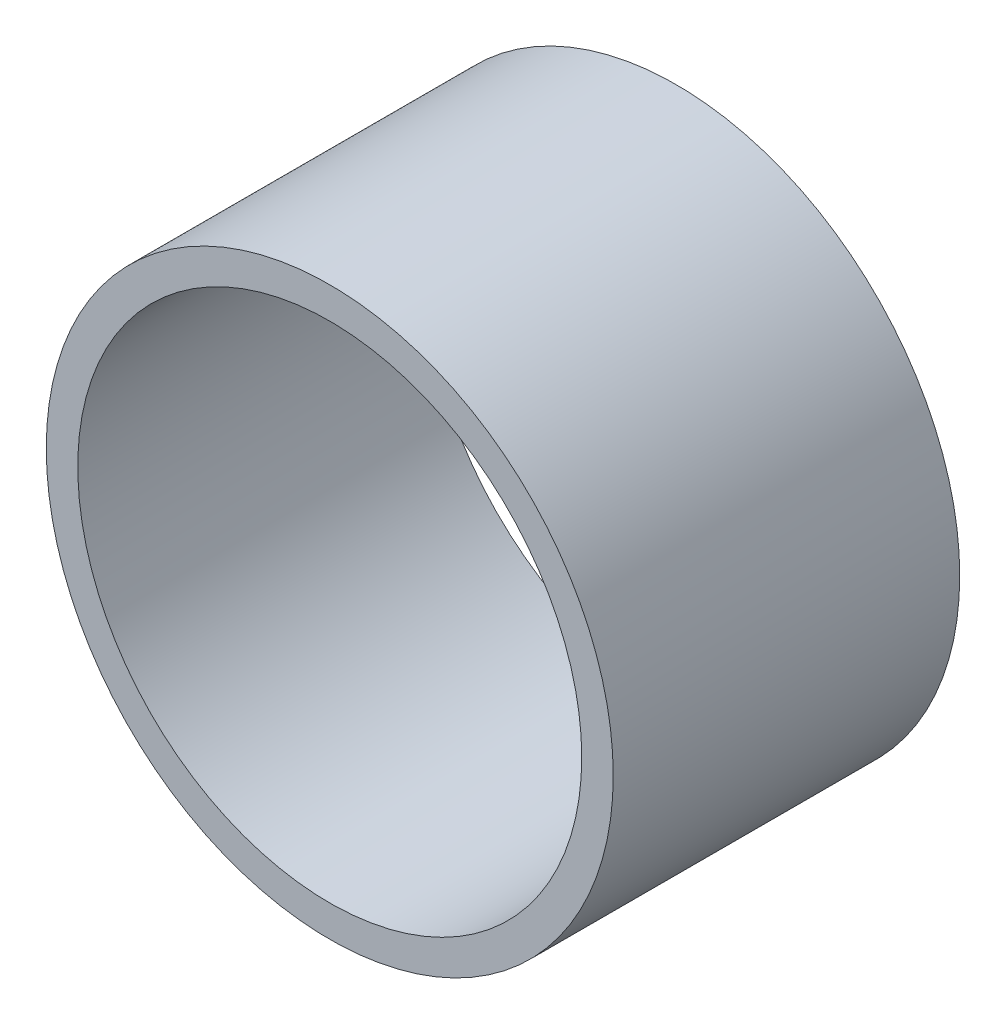
ISO-10303-21;
HEADER;
FILE_DESCRIPTION(('STEP AP214'),'2;1');
FILE_NAME('part.step','',(''),(''),'','','');
FILE_SCHEMA(('AUTOMOTIVE_DESIGN { 1 0 10303 214 1 1 1 1 }'));
ENDSEC;
DATA;
#1=APPLICATION_CONTEXT('core data for automotive mechanical design processes');
#2=APPLICATION_PROTOCOL_DEFINITION('international standard','automotive_design',2000,#1);
#3=PRODUCT_CONTEXT('',#1,'mechanical');
#4=PRODUCT('Part','Part','',(#3));
#5=PRODUCT_RELATED_PRODUCT_CATEGORY('part','',(#4));
#6=PRODUCT_DEFINITION_FORMATION('','',#4);
#7=PRODUCT_DEFINITION_CONTEXT('part definition',#1,'design');
#8=PRODUCT_DEFINITION('design','',#6,#7);
#9=PRODUCT_DEFINITION_SHAPE('','',#8);
#10=(LENGTH_UNIT() NAMED_UNIT(*) SI_UNIT(.MILLI.,.METRE.));
#11=(NAMED_UNIT(*) PLANE_ANGLE_UNIT() SI_UNIT($,.RADIAN.));
#12=(NAMED_UNIT(*) SI_UNIT($,.STERADIAN.) SOLID_ANGLE_UNIT());
#13=UNCERTAINTY_MEASURE_WITH_UNIT(LENGTH_MEASURE(1.E-05),#10,'distance_accuracy_value','');
#14=(GEOMETRIC_REPRESENTATION_CONTEXT(3) GLOBAL_UNCERTAINTY_ASSIGNED_CONTEXT((#13)) GLOBAL_UNIT_ASSIGNED_CONTEXT((#10,
#11,#12)) REPRESENTATION_CONTEXT('',''));
#15=CARTESIAN_POINT('',(0.,0.,0.));
#16=DIRECTION('',(0.,0.,1.));
#17=DIRECTION('',(1.,0.,0.));
#18=AXIS2_PLACEMENT_3D('',#15,#16,#17);
#19=CARTESIAN_POINT('',(0.,0.,22.));
#20=DIRECTION('',(0.,0.,1.));
#21=DIRECTION('',(1.,0.,0.));
#22=AXIS2_PLACEMENT_3D('',#19,#20,#21);
#23=PLANE('',#22);
#24=CARTESIAN_POINT('',(0.,0.,22.));
#25=DIRECTION('',(0.,0.,1.));
#26=DIRECTION('',(1.,0.,0.));
#27=AXIS2_PLACEMENT_3D('',#24,#25,#26);
#28=CIRCLE('',#27,18.);
#29=CARTESIAN_POINT('',(18.,0.,22.));
#30=VERTEX_POINT('',#29);
#31=EDGE_CURVE('E10',#30,#30,#28,.T.);
#32=ORIENTED_EDGE('',*,*,#31,.T.);
#33=EDGE_LOOP('',(#32));
#34=FACE_BOUND('',#33,.T.);
#35=CARTESIAN_POINT('',(0.,0.,22.));
#36=DIRECTION('',(0.,0.,1.));
#37=DIRECTION('',(1.,0.,0.));
#38=AXIS2_PLACEMENT_3D('',#35,#36,#37);
#39=CIRCLE('',#38,16.);
#40=CARTESIAN_POINT('',(16.,0.,22.));
#41=VERTEX_POINT('',#40);
#42=EDGE_CURVE('E38',#41,#41,#39,.T.);
#43=ORIENTED_EDGE('',*,*,#42,.F.);
#44=EDGE_LOOP('',(#43));
#45=FACE_BOUND('',#44,.T.);
#46=ADVANCED_FACE('F27',(#34,#45),#23,.T.);
#47=CARTESIAN_POINT('',(0.,0.,0.));
#48=DIRECTION('',(0.,0.,1.));
#49=DIRECTION('',(1.,0.,0.));
#50=AXIS2_PLACEMENT_3D('',#47,#48,#49);
#51=PLANE('',#50);
#52=CARTESIAN_POINT('',(0.,0.,0.));
#53=DIRECTION('',(0.,0.,1.));
#54=DIRECTION('',(1.,0.,0.));
#55=AXIS2_PLACEMENT_3D('',#52,#53,#54);
#56=CIRCLE('',#55,18.);
#57=CARTESIAN_POINT('',(18.,0.,0.));
#58=VERTEX_POINT('',#57);
#59=EDGE_CURVE('E34',#58,#58,#56,.T.);
#60=ORIENTED_EDGE('',*,*,#59,.F.);
#61=EDGE_LOOP('',(#60));
#62=FACE_BOUND('',#61,.T.);
#63=CARTESIAN_POINT('',(0.,0.,0.));
#64=DIRECTION('',(0.,0.,1.));
#65=DIRECTION('',(1.,0.,0.));
#66=AXIS2_PLACEMENT_3D('',#63,#64,#65);
#67=CIRCLE('',#66,16.);
#68=CARTESIAN_POINT('',(16.,0.,0.));
#69=VERTEX_POINT('',#68);
#70=EDGE_CURVE('E42',#69,#69,#67,.T.);
#71=ORIENTED_EDGE('',*,*,#70,.T.);
#72=EDGE_LOOP('',(#71));
#73=FACE_BOUND('',#72,.T.);
#74=ADVANCED_FACE('F48',(#62,#73),#51,.F.);
#75=CARTESIAN_POINT('',(0.,0.,22.));
#76=DIRECTION('',(0.,0.,-1.));
#77=DIRECTION('',(-1.,0.,0.));
#78=AXIS2_PLACEMENT_3D('',#75,#76,#77);
#79=CYLINDRICAL_SURFACE('',#78,18.);
#80=ORIENTED_EDGE('',*,*,#31,.F.);
#81=EDGE_LOOP('',(#80));
#82=FACE_BOUND('',#81,.T.);
#83=ORIENTED_EDGE('',*,*,#59,.T.);
#84=EDGE_LOOP('',(#83));
#85=FACE_BOUND('',#84,.T.);
#86=ADVANCED_FACE('F29',(#82,#85),#79,.T.);
#87=CARTESIAN_POINT('',(0.,0.,22.));
#88=DIRECTION('',(0.,0.,-1.));
#89=DIRECTION('',(-1.,0.,0.));
#90=AXIS2_PLACEMENT_3D('',#87,#88,#89);
#91=CYLINDRICAL_SURFACE('',#90,16.);
#92=ORIENTED_EDGE('',*,*,#42,.T.);
#93=EDGE_LOOP('',(#92));
#94=FACE_BOUND('',#93,.T.);
#95=ORIENTED_EDGE('',*,*,#70,.F.);
#96=EDGE_LOOP('',(#95));
#97=FACE_BOUND('',#96,.T.);
#98=ADVANCED_FACE('F50',(#94,#97),#91,.F.);
#99=CLOSED_SHELL('',(#46,#74,#86,#98));
#100=MANIFOLD_SOLID_BREP('B2',#99);
#101=ADVANCED_BREP_SHAPE_REPRESENTATION('',(#18,#100),#14);
#102=SHAPE_DEFINITION_REPRESENTATION(#9,#101);
ENDSEC;
END-ISO-10303-21;
